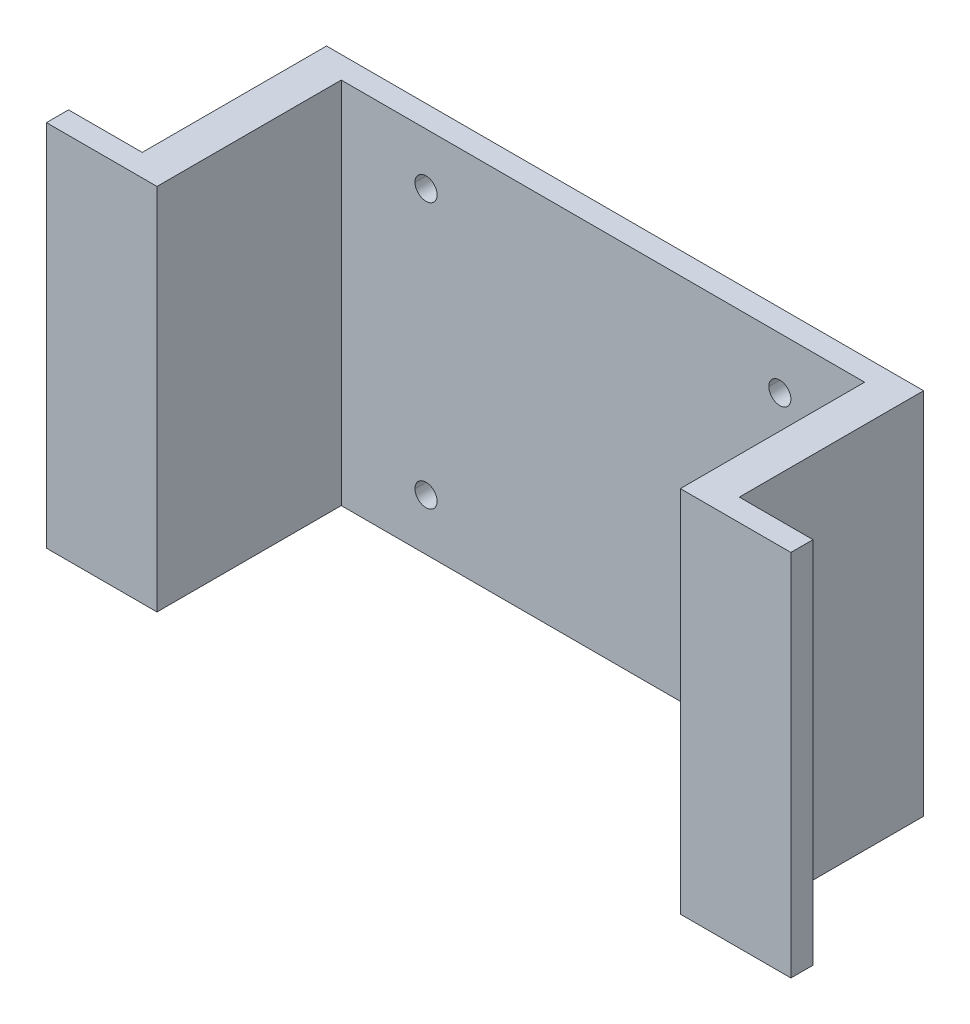
ISO-10303-21;
HEADER;
FILE_DESCRIPTION(('STEP AP214'),'2;1');
FILE_NAME('part.step','',(''),(''),'','','');
FILE_SCHEMA(('AUTOMOTIVE_DESIGN { 1 0 10303 214 1 1 1 1 }'));
ENDSEC;
DATA;
#1=APPLICATION_CONTEXT('core data for automotive mechanical design processes');
#2=APPLICATION_PROTOCOL_DEFINITION('international standard','automotive_design',2000,#1);
#3=PRODUCT_CONTEXT('',#1,'mechanical');
#4=PRODUCT('Part','Part','',(#3));
#5=PRODUCT_RELATED_PRODUCT_CATEGORY('part','',(#4));
#6=PRODUCT_DEFINITION_FORMATION('','',#4);
#7=PRODUCT_DEFINITION_CONTEXT('part definition',#1,'design');
#8=PRODUCT_DEFINITION('design','',#6,#7);
#9=PRODUCT_DEFINITION_SHAPE('','',#8);
#10=(LENGTH_UNIT() NAMED_UNIT(*) SI_UNIT(.MILLI.,.METRE.));
#11=(NAMED_UNIT(*) PLANE_ANGLE_UNIT() SI_UNIT($,.RADIAN.));
#12=(NAMED_UNIT(*) SI_UNIT($,.STERADIAN.) SOLID_ANGLE_UNIT());
#13=UNCERTAINTY_MEASURE_WITH_UNIT(LENGTH_MEASURE(1.E-05),#10,'distance_accuracy_value','');
#14=(GEOMETRIC_REPRESENTATION_CONTEXT(3) GLOBAL_UNCERTAINTY_ASSIGNED_CONTEXT((#13)) GLOBAL_UNIT_ASSIGNED_CONTEXT((#10,
#11,#12)) REPRESENTATION_CONTEXT('',''));
#15=CARTESIAN_POINT('',(0.,0.,0.));
#16=DIRECTION('',(0.,0.,1.));
#17=DIRECTION('',(1.,0.,0.));
#18=AXIS2_PLACEMENT_3D('',#15,#16,#17);
#19=CARTESIAN_POINT('',(50.5,0.,0.));
#20=DIRECTION('',(1.,0.,0.));
#21=DIRECTION('',(0.,1.,0.));
#22=AXIS2_PLACEMENT_3D('',#19,#20,#21);
#23=PLANE('',#22);
#24=DIRECTION('',(0.,0.,1.));
#25=VECTOR('',#24,1.);
#26=CARTESIAN_POINT('',(50.5,25.,25.));
#27=LINE('',#26,#25);
#28=CARTESIAN_POINT('',(50.5,25.,25.));
#29=VERTEX_POINT('',#28);
#30=CARTESIAN_POINT('',(50.5,25.,28.));
#31=VERTEX_POINT('',#30);
#32=EDGE_CURVE('E273',#29,#31,#27,.T.);
#33=ORIENTED_EDGE('',*,*,#32,.T.);
#34=DIRECTION('',(0.,-1.,0.));
#35=VECTOR('',#34,1.);
#36=CARTESIAN_POINT('',(50.5,25.,28.));
#37=LINE('',#36,#35);
#38=CARTESIAN_POINT('',(50.5,-25.,28.));
#39=VERTEX_POINT('',#38);
#40=EDGE_CURVE('E306',#31,#39,#37,.T.);
#41=ORIENTED_EDGE('',*,*,#40,.T.);
#42=DIRECTION('',(0.,0.,-1.));
#43=VECTOR('',#42,1.);
#44=CARTESIAN_POINT('',(50.5,-25.,28.));
#45=LINE('',#44,#43);
#46=CARTESIAN_POINT('',(50.5,-25.,25.));
#47=VERTEX_POINT('',#46);
#48=EDGE_CURVE('E249',#39,#47,#45,.T.);
#49=ORIENTED_EDGE('',*,*,#48,.T.);
#50=DIRECTION('',(0.,1.,0.));
#51=VECTOR('',#50,1.);
#52=CARTESIAN_POINT('',(50.5,-25.,25.));
#53=LINE('',#52,#51);
#54=EDGE_CURVE('E10',#47,#29,#53,.T.);
#55=ORIENTED_EDGE('',*,*,#54,.T.);
#56=EDGE_LOOP('',(#33,#41,#49,#55));
#57=FACE_BOUND('',#56,.T.);
#58=ADVANCED_FACE('F16',(#57),#23,.T.);
#59=CARTESIAN_POINT('',(50.5,-25.,25.));
#60=DIRECTION('',(0.,0.,1.));
#61=DIRECTION('',(1.,0.,0.));
#62=AXIS2_PLACEMENT_3D('',#59,#60,#61);
#63=PLANE('',#62);
#64=DIRECTION('',(0.,1.,0.));
#65=VECTOR('',#64,1.);
#66=CARTESIAN_POINT('',(40.5,-25.,25.));
#67=LINE('',#66,#65);
#68=CARTESIAN_POINT('',(40.5,-25.,25.));
#69=VERTEX_POINT('',#68);
#70=CARTESIAN_POINT('',(40.5,25.,25.));
#71=VERTEX_POINT('',#70);
#72=EDGE_CURVE('E289',#69,#71,#67,.T.);
#73=ORIENTED_EDGE('',*,*,#72,.T.);
#74=DIRECTION('',(-1.,0.,0.));
#75=VECTOR('',#74,1.);
#76=CARTESIAN_POINT('',(50.5,25.,25.));
#77=LINE('',#76,#75);
#78=EDGE_CURVE('E276',#29,#71,#77,.T.);
#79=ORIENTED_EDGE('',*,*,#78,.F.);
#80=ORIENTED_EDGE('',*,*,#54,.F.);
#81=DIRECTION('',(-1.,0.,0.));
#82=VECTOR('',#81,1.);
#83=CARTESIAN_POINT('',(50.5,-25.,25.));
#84=LINE('',#83,#82);
#85=EDGE_CURVE('E94',#47,#69,#84,.T.);
#86=ORIENTED_EDGE('',*,*,#85,.T.);
#87=EDGE_LOOP('',(#73,#79,#80,#86));
#88=FACE_BOUND('',#87,.T.);
#89=ADVANCED_FACE('F451',(#88),#63,.F.);
#90=CARTESIAN_POINT('',(-50.5,0.,0.));
#91=DIRECTION('',(-1.,0.,0.));
#92=DIRECTION('',(0.,0.,1.));
#93=AXIS2_PLACEMENT_3D('',#90,#91,#92);
#94=PLANE('',#93);
#95=DIRECTION('',(0.,0.,-1.));
#96=VECTOR('',#95,1.);
#97=CARTESIAN_POINT('',(-50.5,25.,28.));
#98=LINE('',#97,#96);
#99=CARTESIAN_POINT('',(-50.5,25.,28.));
#100=VERTEX_POINT('',#99);
#101=CARTESIAN_POINT('',(-50.5,25.,25.));
#102=VERTEX_POINT('',#101);
#103=EDGE_CURVE('E303',#100,#102,#98,.T.);
#104=ORIENTED_EDGE('',*,*,#103,.T.);
#105=DIRECTION('',(0.,-1.,0.));
#106=VECTOR('',#105,1.);
#107=CARTESIAN_POINT('',(-50.5,25.,25.));
#108=LINE('',#107,#106);
#109=CARTESIAN_POINT('',(-50.5,-25.,25.));
#110=VERTEX_POINT('',#109);
#111=EDGE_CURVE('E27',#102,#110,#108,.T.);
#112=ORIENTED_EDGE('',*,*,#111,.T.);
#113=DIRECTION('',(0.,0.,1.));
#114=VECTOR('',#113,1.);
#115=CARTESIAN_POINT('',(-50.5,-25.,25.));
#116=LINE('',#115,#114);
#117=CARTESIAN_POINT('',(-50.5,-25.,28.));
#118=VERTEX_POINT('',#117);
#119=EDGE_CURVE('E285',#110,#118,#116,.T.);
#120=ORIENTED_EDGE('',*,*,#119,.T.);
#121=DIRECTION('',(0.,1.,0.));
#122=VECTOR('',#121,1.);
#123=CARTESIAN_POINT('',(-50.5,-25.,28.));
#124=LINE('',#123,#122);
#125=EDGE_CURVE('E318',#118,#100,#124,.T.);
#126=ORIENTED_EDGE('',*,*,#125,.T.);
#127=EDGE_LOOP('',(#104,#112,#120,#126));
#128=FACE_BOUND('',#127,.T.);
#129=ADVANCED_FACE('F449',(#128),#94,.T.);
#130=CARTESIAN_POINT('',(-50.5,25.,25.));
#131=DIRECTION('',(0.,0.,1.));
#132=DIRECTION('',(0.,-1.,0.));
#133=AXIS2_PLACEMENT_3D('',#130,#131,#132);
#134=PLANE('',#133);
#135=DIRECTION('',(0.,-1.,0.));
#136=VECTOR('',#135,1.);
#137=CARTESIAN_POINT('',(-40.5,25.,25.));
#138=LINE('',#137,#136);
#139=CARTESIAN_POINT('',(-40.5,25.,25.));
#140=VERTEX_POINT('',#139);
#141=CARTESIAN_POINT('',(-40.5,-25.,25.));
#142=VERTEX_POINT('',#141);
#143=EDGE_CURVE('E267',#140,#142,#138,.T.);
#144=ORIENTED_EDGE('',*,*,#143,.T.);
#145=DIRECTION('',(1.,0.,0.));
#146=VECTOR('',#145,1.);
#147=CARTESIAN_POINT('',(-50.5,-25.,25.));
#148=LINE('',#147,#146);
#149=EDGE_CURVE('E209',#110,#142,#148,.T.);
#150=ORIENTED_EDGE('',*,*,#149,.F.);
#151=ORIENTED_EDGE('',*,*,#111,.F.);
#152=DIRECTION('',(1.,0.,0.));
#153=VECTOR('',#152,1.);
#154=CARTESIAN_POINT('',(-50.5,25.,25.));
#155=LINE('',#154,#153);
#156=EDGE_CURVE('E300',#102,#140,#155,.T.);
#157=ORIENTED_EDGE('',*,*,#156,.T.);
#158=EDGE_LOOP('',(#144,#150,#151,#157));
#159=FACE_BOUND('',#158,.T.);
#160=ADVANCED_FACE('F448',(#159),#134,.F.);
#161=CARTESIAN_POINT('',(0.,0.,28.));
#162=DIRECTION('',(0.,0.,-1.));
#163=DIRECTION('',(0.,-1.,0.));
#164=AXIS2_PLACEMENT_3D('',#161,#162,#163);
#165=PLANE('',#164);
#166=DIRECTION('',(-1.,0.,0.));
#167=VECTOR('',#166,1.);
#168=CARTESIAN_POINT('',(35.5,25.,28.));
#169=LINE('',#168,#167);
#170=CARTESIAN_POINT('',(35.5,25.,28.));
#171=VERTEX_POINT('',#170);
#172=EDGE_CURVE('E277',#31,#171,#169,.T.);
#173=ORIENTED_EDGE('',*,*,#172,.T.);
#174=DIRECTION('',(0.,-1.,0.));
#175=VECTOR('',#174,1.);
#176=CARTESIAN_POINT('',(35.5,-25.,28.));
#177=LINE('',#176,#175);
#178=CARTESIAN_POINT('',(35.5,-25.,28.));
#179=VERTEX_POINT('',#178);
#180=EDGE_CURVE('E360',#171,#179,#177,.T.);
#181=ORIENTED_EDGE('',*,*,#180,.T.);
#182=DIRECTION('',(1.,0.,0.));
#183=VECTOR('',#182,1.);
#184=CARTESIAN_POINT('',(40.5,-25.,28.));
#185=LINE('',#184,#183);
#186=EDGE_CURVE('E237',#179,#39,#185,.T.);
#187=ORIENTED_EDGE('',*,*,#186,.T.);
#188=ORIENTED_EDGE('',*,*,#40,.F.);
#189=EDGE_LOOP('',(#173,#181,#187,#188));
#190=FACE_BOUND('',#189,.T.);
#191=ADVANCED_FACE('F458',(#190),#165,.F.);
#192=CARTESIAN_POINT('',(35.5,-25.,28.));
#193=DIRECTION('',(1.,0.,0.));
#194=DIRECTION('',(0.,1.,0.));
#195=AXIS2_PLACEMENT_3D('',#192,#193,#194);
#196=PLANE('',#195);
#197=DIRECTION('',(0.,-1.,0.));
#198=VECTOR('',#197,1.);
#199=CARTESIAN_POINT('',(35.5,-25.,3.));
#200=LINE('',#199,#198);
#201=CARTESIAN_POINT('',(35.5,25.,3.));
#202=VERTEX_POINT('',#201);
#203=CARTESIAN_POINT('',(35.5,-25.,3.));
#204=VERTEX_POINT('',#203);
#205=EDGE_CURVE('E335',#202,#204,#200,.T.);
#206=ORIENTED_EDGE('',*,*,#205,.T.);
#207=DIRECTION('',(0.,0.,-1.));
#208=VECTOR('',#207,1.);
#209=CARTESIAN_POINT('',(35.5,-25.,28.));
#210=LINE('',#209,#208);
#211=EDGE_CURVE('E232',#179,#204,#210,.T.);
#212=ORIENTED_EDGE('',*,*,#211,.F.);
#213=ORIENTED_EDGE('',*,*,#180,.F.);
#214=DIRECTION('',(0.,0.,-1.));
#215=VECTOR('',#214,1.);
#216=CARTESIAN_POINT('',(35.5,25.,28.));
#217=LINE('',#216,#215);
#218=EDGE_CURVE('E328',#171,#202,#217,.T.);
#219=ORIENTED_EDGE('',*,*,#218,.T.);
#220=EDGE_LOOP('',(#206,#212,#213,#219));
#221=FACE_BOUND('',#220,.T.);
#222=ADVANCED_FACE('F472',(#221),#196,.F.);
#223=CARTESIAN_POINT('',(0.,0.,28.));
#224=DIRECTION('',(0.,0.,1.));
#225=DIRECTION('',(1.,0.,0.));
#226=AXIS2_PLACEMENT_3D('',#223,#224,#225);
#227=PLANE('',#226);
#228=DIRECTION('',(-1.,0.,0.));
#229=VECTOR('',#228,1.);
#230=CARTESIAN_POINT('',(-35.5,25.,28.));
#231=LINE('',#230,#229);
#232=CARTESIAN_POINT('',(-35.5,25.,28.));
#233=VERTEX_POINT('',#232);
#234=EDGE_CURVE('E327',#233,#100,#231,.T.);
#235=ORIENTED_EDGE('',*,*,#234,.T.);
#236=ORIENTED_EDGE('',*,*,#125,.F.);
#237=DIRECTION('',(1.,0.,0.));
#238=VECTOR('',#237,1.);
#239=CARTESIAN_POINT('',(-40.5,-25.,28.));
#240=LINE('',#239,#238);
#241=CARTESIAN_POINT('',(-35.5,-25.,28.));
#242=VERTEX_POINT('',#241);
#243=EDGE_CURVE('E288',#118,#242,#240,.T.);
#244=ORIENTED_EDGE('',*,*,#243,.T.);
#245=DIRECTION('',(0.,1.,0.));
#246=VECTOR('',#245,1.);
#247=CARTESIAN_POINT('',(-35.5,-25.,28.));
#248=LINE('',#247,#246);
#249=EDGE_CURVE('E315',#242,#233,#248,.T.);
#250=ORIENTED_EDGE('',*,*,#249,.T.);
#251=EDGE_LOOP('',(#235,#236,#244,#250));
#252=FACE_BOUND('',#251,.T.);
#253=ADVANCED_FACE('F403',(#252),#227,.T.);
#254=CARTESIAN_POINT('',(-35.5,-25.,28.));
#255=DIRECTION('',(-1.,0.,0.));
#256=DIRECTION('',(0.,0.,1.));
#257=AXIS2_PLACEMENT_3D('',#254,#255,#256);
#258=PLANE('',#257);
#259=DIRECTION('',(0.,1.,0.));
#260=VECTOR('',#259,1.);
#261=CARTESIAN_POINT('',(-35.5,-25.,3.));
#262=LINE('',#261,#260);
#263=CARTESIAN_POINT('',(-35.5,-25.,3.));
#264=VERTEX_POINT('',#263);
#265=CARTESIAN_POINT('',(-35.5,25.,3.));
#266=VERTEX_POINT('',#265);
#267=EDGE_CURVE('E341',#264,#266,#262,.T.);
#268=ORIENTED_EDGE('',*,*,#267,.T.);
#269=DIRECTION('',(0.,0.,-1.));
#270=VECTOR('',#269,1.);
#271=CARTESIAN_POINT('',(-35.5,25.,28.));
#272=LINE('',#271,#270);
#273=EDGE_CURVE('E331',#233,#266,#272,.T.);
#274=ORIENTED_EDGE('',*,*,#273,.F.);
#275=ORIENTED_EDGE('',*,*,#249,.F.);
#276=DIRECTION('',(0.,0.,-1.));
#277=VECTOR('',#276,1.);
#278=CARTESIAN_POINT('',(-35.5,-25.,28.));
#279=LINE('',#278,#277);
#280=EDGE_CURVE('E236',#242,#264,#279,.T.);
#281=ORIENTED_EDGE('',*,*,#280,.T.);
#282=EDGE_LOOP('',(#268,#274,#275,#281));
#283=FACE_BOUND('',#282,.T.);
#284=ADVANCED_FACE('F410',(#283),#258,.F.);
#285=CARTESIAN_POINT('',(-24.,18.,3.));
#286=DIRECTION('',(0.,0.,-1.));
#287=DIRECTION('',(-1.,0.,0.));
#288=AXIS2_PLACEMENT_3D('',#285,#286,#287);
#289=CYLINDRICAL_SURFACE('',#288,1.5);
#290=DIRECTION('',(0.,0.,-1.));
#291=VECTOR('',#290,1.);
#292=CARTESIAN_POINT('',(-22.5,18.,3.));
#293=LINE('',#292,#291);
#294=CARTESIAN_POINT('',(-22.5,18.,3.));
#295=VERTEX_POINT('',#294);
#296=CARTESIAN_POINT('',(-22.5,18.,0.));
#297=VERTEX_POINT('',#296);
#298=EDGE_CURVE('E220',#295,#297,#293,.T.);
#299=ORIENTED_EDGE('',*,*,#298,.F.);
#300=CARTESIAN_POINT('',(-24.,18.,3.));
#301=DIRECTION('',(0.,0.,-1.));
#302=DIRECTION('',(-1.,0.,0.));
#303=AXIS2_PLACEMENT_3D('',#300,#301,#302);
#304=CIRCLE('',#303,1.5);
#305=CARTESIAN_POINT('',(-25.5,18.,3.));
#306=VERTEX_POINT('',#305);
#307=EDGE_CURVE('E213',#306,#295,#304,.T.);
#308=ORIENTED_EDGE('',*,*,#307,.F.);
#309=DIRECTION('',(0.,0.,-1.));
#310=VECTOR('',#309,1.);
#311=CARTESIAN_POINT('',(-25.5,18.,3.));
#312=LINE('',#311,#310);
#313=CARTESIAN_POINT('',(-25.5,18.,0.));
#314=VERTEX_POINT('',#313);
#315=EDGE_CURVE('E20',#306,#314,#312,.T.);
#316=ORIENTED_EDGE('',*,*,#315,.T.);
#317=CARTESIAN_POINT('',(-24.,18.,0.));
#318=DIRECTION('',(0.,0.,-1.));
#319=DIRECTION('',(-1.,0.,0.));
#320=AXIS2_PLACEMENT_3D('',#317,#318,#319);
#321=CIRCLE('',#320,1.5);
#322=EDGE_CURVE('E199',#314,#297,#321,.T.);
#323=ORIENTED_EDGE('',*,*,#322,.T.);
#324=EDGE_LOOP('',(#299,#308,#316,#323));
#325=FACE_BOUND('',#324,.T.);
#326=ADVANCED_FACE('F212',(#325),#289,.F.);
#327=CARTESIAN_POINT('',(24.,-18.,3.));
#328=DIRECTION('',(0.,0.,-1.));
#329=DIRECTION('',(-1.,0.,0.));
#330=AXIS2_PLACEMENT_3D('',#327,#328,#329);
#331=CYLINDRICAL_SURFACE('',#330,1.5);
#332=DIRECTION('',(0.,0.,-1.));
#333=VECTOR('',#332,1.);
#334=CARTESIAN_POINT('',(25.5,-18.,3.));
#335=LINE('',#334,#333);
#336=CARTESIAN_POINT('',(25.5,-18.,3.));
#337=VERTEX_POINT('',#336);
#338=CARTESIAN_POINT('',(25.5,-18.,0.));
#339=VERTEX_POINT('',#338);
#340=EDGE_CURVE('E242',#337,#339,#335,.T.);
#341=ORIENTED_EDGE('',*,*,#340,.F.);
#342=CARTESIAN_POINT('',(24.,-18.,3.));
#343=DIRECTION('',(0.,0.,-1.));
#344=DIRECTION('',(-1.,0.,0.));
#345=AXIS2_PLACEMENT_3D('',#342,#343,#344);
#346=CIRCLE('',#345,1.5);
#347=CARTESIAN_POINT('',(22.5,-18.,3.));
#348=VERTEX_POINT('',#347);
#349=EDGE_CURVE('E248',#348,#337,#346,.T.);
#350=ORIENTED_EDGE('',*,*,#349,.F.);
#351=DIRECTION('',(0.,0.,-1.));
#352=VECTOR('',#351,1.);
#353=CARTESIAN_POINT('',(22.5,-18.,3.));
#354=LINE('',#353,#352);
#355=CARTESIAN_POINT('',(22.5,-18.,0.));
#356=VERTEX_POINT('',#355);
#357=EDGE_CURVE('E230',#348,#356,#354,.T.);
#358=ORIENTED_EDGE('',*,*,#357,.T.);
#359=CARTESIAN_POINT('',(24.,-18.,0.));
#360=DIRECTION('',(0.,0.,-1.));
#361=DIRECTION('',(-1.,0.,0.));
#362=AXIS2_PLACEMENT_3D('',#359,#360,#361);
#363=CIRCLE('',#362,1.5);
#364=EDGE_CURVE('E208',#356,#339,#363,.T.);
#365=ORIENTED_EDGE('',*,*,#364,.T.);
#366=EDGE_LOOP('',(#341,#350,#358,#365));
#367=FACE_BOUND('',#366,.T.);
#368=ADVANCED_FACE('F468',(#367),#331,.F.);
#369=CARTESIAN_POINT('',(-24.,-18.,3.));
#370=DIRECTION('',(0.,0.,-1.));
#371=DIRECTION('',(-1.,0.,0.));
#372=AXIS2_PLACEMENT_3D('',#369,#370,#371);
#373=CYLINDRICAL_SURFACE('',#372,1.5);
#374=DIRECTION('',(0.,0.,-1.));
#375=VECTOR('',#374,1.);
#376=CARTESIAN_POINT('',(-22.5,-18.,3.));
#377=LINE('',#376,#375);
#378=CARTESIAN_POINT('',(-22.5,-18.,3.));
#379=VERTEX_POINT('',#378);
#380=CARTESIAN_POINT('',(-22.5,-18.,0.));
#381=VERTEX_POINT('',#380);
#382=EDGE_CURVE('E259',#379,#381,#377,.T.);
#383=ORIENTED_EDGE('',*,*,#382,.F.);
#384=CARTESIAN_POINT('',(-24.,-18.,3.));
#385=DIRECTION('',(0.,0.,-1.));
#386=DIRECTION('',(-1.,0.,0.));
#387=AXIS2_PLACEMENT_3D('',#384,#385,#386);
#388=CIRCLE('',#387,1.5);
#389=CARTESIAN_POINT('',(-25.5,-18.,3.));
#390=VERTEX_POINT('',#389);
#391=EDGE_CURVE('E243',#390,#379,#388,.T.);
#392=ORIENTED_EDGE('',*,*,#391,.F.);
#393=DIRECTION('',(0.,0.,-1.));
#394=VECTOR('',#393,1.);
#395=CARTESIAN_POINT('',(-25.5,-18.,3.));
#396=LINE('',#395,#394);
#397=CARTESIAN_POINT('',(-25.5,-18.,0.));
#398=VERTEX_POINT('',#397);
#399=EDGE_CURVE('E310',#390,#398,#396,.T.);
#400=ORIENTED_EDGE('',*,*,#399,.T.);
#401=CARTESIAN_POINT('',(-24.,-18.,0.));
#402=DIRECTION('',(0.,0.,-1.));
#403=DIRECTION('',(-1.,0.,0.));
#404=AXIS2_PLACEMENT_3D('',#401,#402,#403);
#405=CIRCLE('',#404,1.5);
#406=EDGE_CURVE('E263',#398,#381,#405,.T.);
#407=ORIENTED_EDGE('',*,*,#406,.T.);
#408=EDGE_LOOP('',(#383,#392,#400,#407));
#409=FACE_BOUND('',#408,.T.);
#410=ADVANCED_FACE('F18',(#409),#373,.F.);
#411=CARTESIAN_POINT('',(24.,18.,3.));
#412=DIRECTION('',(0.,0.,-1.));
#413=DIRECTION('',(-1.,0.,0.));
#414=AXIS2_PLACEMENT_3D('',#411,#412,#413);
#415=CYLINDRICAL_SURFACE('',#414,1.5);
#416=DIRECTION('',(0.,0.,-1.));
#417=VECTOR('',#416,1.);
#418=CARTESIAN_POINT('',(25.5,18.,3.));
#419=LINE('',#418,#417);
#420=CARTESIAN_POINT('',(25.5,18.,3.));
#421=VERTEX_POINT('',#420);
#422=CARTESIAN_POINT('',(25.5,18.,0.));
#423=VERTEX_POINT('',#422);
#424=EDGE_CURVE('E294',#421,#423,#419,.T.);
#425=ORIENTED_EDGE('',*,*,#424,.F.);
#426=CARTESIAN_POINT('',(24.,18.,3.));
#427=DIRECTION('',(0.,0.,-1.));
#428=DIRECTION('',(-1.,0.,0.));
#429=AXIS2_PLACEMENT_3D('',#426,#427,#428);
#430=CIRCLE('',#429,1.5);
#431=CARTESIAN_POINT('',(22.5,18.,3.));
#432=VERTEX_POINT('',#431);
#433=EDGE_CURVE('E247',#432,#421,#430,.T.);
#434=ORIENTED_EDGE('',*,*,#433,.F.);
#435=DIRECTION('',(0.,0.,-1.));
#436=VECTOR('',#435,1.);
#437=CARTESIAN_POINT('',(22.5,18.,3.));
#438=LINE('',#437,#436);
#439=CARTESIAN_POINT('',(22.5,18.,0.));
#440=VERTEX_POINT('',#439);
#441=EDGE_CURVE('E293',#432,#440,#438,.T.);
#442=ORIENTED_EDGE('',*,*,#441,.T.);
#443=CARTESIAN_POINT('',(24.,18.,0.));
#444=DIRECTION('',(0.,0.,-1.));
#445=DIRECTION('',(-1.,0.,0.));
#446=AXIS2_PLACEMENT_3D('',#443,#444,#445);
#447=CIRCLE('',#446,1.5);
#448=EDGE_CURVE('E80',#440,#423,#447,.T.);
#449=ORIENTED_EDGE('',*,*,#448,.T.);
#450=EDGE_LOOP('',(#425,#434,#442,#449));
#451=FACE_BOUND('',#450,.T.);
#452=ADVANCED_FACE('F484',(#451),#415,.F.);
#453=CARTESIAN_POINT('',(0.,0.,0.));
#454=DIRECTION('',(0.,0.,1.));
#455=DIRECTION('',(1.,0.,0.));
#456=AXIS2_PLACEMENT_3D('',#453,#454,#455);
#457=PLANE('',#456);
#458=ORIENTED_EDGE('',*,*,#448,.F.);
#459=CARTESIAN_POINT('',(24.,18.,0.));
#460=DIRECTION('',(0.,0.,-1.));
#461=DIRECTION('',(-1.,0.,0.));
#462=AXIS2_PLACEMENT_3D('',#459,#460,#461);
#463=CIRCLE('',#462,1.5);
#464=EDGE_CURVE('E297',#423,#440,#463,.T.);
#465=ORIENTED_EDGE('',*,*,#464,.F.);
#466=EDGE_LOOP('',(#458,#465));
#467=FACE_BOUND('',#466,.T.);
#468=ORIENTED_EDGE('',*,*,#406,.F.);
#469=CARTESIAN_POINT('',(-24.,-18.,0.));
#470=DIRECTION('',(0.,0.,-1.));
#471=DIRECTION('',(-1.,0.,0.));
#472=AXIS2_PLACEMENT_3D('',#469,#470,#471);
#473=CIRCLE('',#472,1.5);
#474=EDGE_CURVE('E314',#381,#398,#473,.T.);
#475=ORIENTED_EDGE('',*,*,#474,.F.);
#476=EDGE_LOOP('',(#468,#475));
#477=FACE_BOUND('',#476,.T.);
#478=ORIENTED_EDGE('',*,*,#364,.F.);
#479=CARTESIAN_POINT('',(24.,-18.,0.));
#480=DIRECTION('',(0.,0.,-1.));
#481=DIRECTION('',(-1.,0.,0.));
#482=AXIS2_PLACEMENT_3D('',#479,#480,#481);
#483=CIRCLE('',#482,1.5);
#484=EDGE_CURVE('E238',#339,#356,#483,.T.);
#485=ORIENTED_EDGE('',*,*,#484,.F.);
#486=EDGE_LOOP('',(#478,#485));
#487=FACE_BOUND('',#486,.T.);
#488=ORIENTED_EDGE('',*,*,#322,.F.);
#489=CARTESIAN_POINT('',(-24.,18.,0.));
#490=DIRECTION('',(0.,0.,-1.));
#491=DIRECTION('',(-1.,0.,0.));
#492=AXIS2_PLACEMENT_3D('',#489,#490,#491);
#493=CIRCLE('',#492,1.5);
#494=EDGE_CURVE('E203',#297,#314,#493,.T.);
#495=ORIENTED_EDGE('',*,*,#494,.F.);
#496=EDGE_LOOP('',(#488,#495));
#497=FACE_BOUND('',#496,.T.);
#498=DIRECTION('',(0.,1.,0.));
#499=VECTOR('',#498,1.);
#500=CARTESIAN_POINT('',(40.5,25.,0.));
#501=LINE('',#500,#499);
#502=CARTESIAN_POINT('',(40.5,-25.,0.));
#503=VERTEX_POINT('',#502);
#504=CARTESIAN_POINT('',(40.5,25.,0.));
#505=VERTEX_POINT('',#504);
#506=EDGE_CURVE('E321',#503,#505,#501,.T.);
#507=ORIENTED_EDGE('',*,*,#506,.F.);
#508=DIRECTION('',(1.,0.,0.));
#509=VECTOR('',#508,1.);
#510=CARTESIAN_POINT('',(-40.5,-25.,0.));
#511=LINE('',#510,#509);
#512=CARTESIAN_POINT('',(-40.5,-25.,0.));
#513=VERTEX_POINT('',#512);
#514=EDGE_CURVE('E140',#513,#503,#511,.T.);
#515=ORIENTED_EDGE('',*,*,#514,.F.);
#516=DIRECTION('',(0.,-1.,0.));
#517=VECTOR('',#516,1.);
#518=CARTESIAN_POINT('',(-40.5,25.,0.));
#519=LINE('',#518,#517);
#520=CARTESIAN_POINT('',(-40.5,25.,0.));
#521=VERTEX_POINT('',#520);
#522=EDGE_CURVE('E351',#521,#513,#519,.T.);
#523=ORIENTED_EDGE('',*,*,#522,.F.);
#524=DIRECTION('',(-1.,0.,0.));
#525=VECTOR('',#524,1.);
#526=CARTESIAN_POINT('',(-40.5,25.,0.));
#527=LINE('',#526,#525);
#528=EDGE_CURVE('E153',#505,#521,#527,.T.);
#529=ORIENTED_EDGE('',*,*,#528,.F.);
#530=EDGE_LOOP('',(#507,#515,#523,#529));
#531=FACE_BOUND('',#530,.T.);
#532=ADVANCED_FACE('F201',(#467,#477,#487,#497,#531),#457,.F.);
#533=CARTESIAN_POINT('',(-40.5,-25.,3.));
#534=DIRECTION('',(0.,1.,0.));
#535=DIRECTION('',(1.,0.,0.));
#536=AXIS2_PLACEMENT_3D('',#533,#534,#535);
#537=PLANE('',#536);
#538=ORIENTED_EDGE('',*,*,#514,.T.);
#539=DIRECTION('',(0.,0.,-1.));
#540=VECTOR('',#539,1.);
#541=CARTESIAN_POINT('',(40.5,-25.,3.));
#542=LINE('',#541,#540);
#543=EDGE_CURVE('E292',#69,#503,#542,.T.);
#544=ORIENTED_EDGE('',*,*,#543,.F.);
#545=ORIENTED_EDGE('',*,*,#85,.F.);
#546=ORIENTED_EDGE('',*,*,#48,.F.);
#547=ORIENTED_EDGE('',*,*,#186,.F.);
#548=ORIENTED_EDGE('',*,*,#211,.T.);
#549=DIRECTION('',(1.,0.,0.));
#550=VECTOR('',#549,1.);
#551=CARTESIAN_POINT('',(-40.5,-25.,3.));
#552=LINE('',#551,#550);
#553=EDGE_CURVE('E340',#264,#204,#552,.T.);
#554=ORIENTED_EDGE('',*,*,#553,.F.);
#555=ORIENTED_EDGE('',*,*,#280,.F.);
#556=ORIENTED_EDGE('',*,*,#243,.F.);
#557=ORIENTED_EDGE('',*,*,#119,.F.);
#558=ORIENTED_EDGE('',*,*,#149,.T.);
#559=DIRECTION('',(0.,0.,-1.));
#560=VECTOR('',#559,1.);
#561=CARTESIAN_POINT('',(-40.5,-25.,3.));
#562=LINE('',#561,#560);
#563=EDGE_CURVE('E364',#142,#513,#562,.T.);
#564=ORIENTED_EDGE('',*,*,#563,.T.);
#565=EDGE_LOOP('',(#538,#544,#545,#546,#547,#548,#554,#555,#556,#557,#558,#564));
#566=FACE_BOUND('',#565,.T.);
#567=ADVANCED_FACE('F407',(#566),#537,.F.);
#568=CARTESIAN_POINT('',(-40.5,25.,3.));
#569=DIRECTION('',(0.,-1.,0.));
#570=DIRECTION('',(0.,0.,-1.));
#571=AXIS2_PLACEMENT_3D('',#568,#569,#570);
#572=PLANE('',#571);
#573=ORIENTED_EDGE('',*,*,#528,.T.);
#574=DIRECTION('',(0.,0.,-1.));
#575=VECTOR('',#574,1.);
#576=CARTESIAN_POINT('',(-40.5,25.,3.));
#577=LINE('',#576,#575);
#578=EDGE_CURVE('E271',#140,#521,#577,.T.);
#579=ORIENTED_EDGE('',*,*,#578,.F.);
#580=ORIENTED_EDGE('',*,*,#156,.F.);
#581=ORIENTED_EDGE('',*,*,#103,.F.);
#582=ORIENTED_EDGE('',*,*,#234,.F.);
#583=ORIENTED_EDGE('',*,*,#273,.T.);
#584=DIRECTION('',(-1.,0.,0.));
#585=VECTOR('',#584,1.);
#586=CARTESIAN_POINT('',(-40.5,25.,3.));
#587=LINE('',#586,#585);
#588=EDGE_CURVE('E339',#202,#266,#587,.T.);
#589=ORIENTED_EDGE('',*,*,#588,.F.);
#590=ORIENTED_EDGE('',*,*,#218,.F.);
#591=ORIENTED_EDGE('',*,*,#172,.F.);
#592=ORIENTED_EDGE('',*,*,#32,.F.);
#593=ORIENTED_EDGE('',*,*,#78,.T.);
#594=DIRECTION('',(0.,0.,-1.));
#595=VECTOR('',#594,1.);
#596=CARTESIAN_POINT('',(40.5,25.,3.));
#597=LINE('',#596,#595);
#598=EDGE_CURVE('E272',#71,#505,#597,.T.);
#599=ORIENTED_EDGE('',*,*,#598,.T.);
#600=EDGE_LOOP('',(#573,#579,#580,#581,#582,#583,#589,#590,#591,#592,#593,#599));
#601=FACE_BOUND('',#600,.T.);
#602=ADVANCED_FACE('F420',(#601),#572,.F.);
#603=CARTESIAN_POINT('',(0.,0.,3.));
#604=DIRECTION('',(0.,0.,1.));
#605=DIRECTION('',(1.,0.,0.));
#606=AXIS2_PLACEMENT_3D('',#603,#604,#605);
#607=PLANE('',#606);
#608=ORIENTED_EDGE('',*,*,#433,.T.);
#609=CARTESIAN_POINT('',(24.,18.,3.));
#610=DIRECTION('',(0.,0.,-1.));
#611=DIRECTION('',(-1.,0.,0.));
#612=AXIS2_PLACEMENT_3D('',#609,#610,#611);
#613=CIRCLE('',#612,1.5);
#614=EDGE_CURVE('E298',#421,#432,#613,.T.);
#615=ORIENTED_EDGE('',*,*,#614,.T.);
#616=EDGE_LOOP('',(#608,#615));
#617=FACE_BOUND('',#616,.T.);
#618=ORIENTED_EDGE('',*,*,#391,.T.);
#619=CARTESIAN_POINT('',(-24.,-18.,3.));
#620=DIRECTION('',(0.,0.,-1.));
#621=DIRECTION('',(-1.,0.,0.));
#622=AXIS2_PLACEMENT_3D('',#619,#620,#621);
#623=CIRCLE('',#622,1.5);
#624=EDGE_CURVE('E255',#379,#390,#623,.T.);
#625=ORIENTED_EDGE('',*,*,#624,.T.);
#626=EDGE_LOOP('',(#618,#625));
#627=FACE_BOUND('',#626,.T.);
#628=ORIENTED_EDGE('',*,*,#349,.T.);
#629=CARTESIAN_POINT('',(24.,-18.,3.));
#630=DIRECTION('',(0.,0.,-1.));
#631=DIRECTION('',(-1.,0.,0.));
#632=AXIS2_PLACEMENT_3D('',#629,#630,#631);
#633=CIRCLE('',#632,1.5);
#634=EDGE_CURVE('E218',#337,#348,#633,.T.);
#635=ORIENTED_EDGE('',*,*,#634,.T.);
#636=EDGE_LOOP('',(#628,#635));
#637=FACE_BOUND('',#636,.T.);
#638=ORIENTED_EDGE('',*,*,#307,.T.);
#639=CARTESIAN_POINT('',(-24.,18.,3.));
#640=DIRECTION('',(0.,0.,-1.));
#641=DIRECTION('',(-1.,0.,0.));
#642=AXIS2_PLACEMENT_3D('',#639,#640,#641);
#643=CIRCLE('',#642,1.5);
#644=EDGE_CURVE('E226',#295,#306,#643,.T.);
#645=ORIENTED_EDGE('',*,*,#644,.T.);
#646=EDGE_LOOP('',(#638,#645));
#647=FACE_BOUND('',#646,.T.);
#648=ORIENTED_EDGE('',*,*,#553,.T.);
#649=ORIENTED_EDGE('',*,*,#205,.F.);
#650=ORIENTED_EDGE('',*,*,#588,.T.);
#651=ORIENTED_EDGE('',*,*,#267,.F.);
#652=EDGE_LOOP('',(#648,#649,#650,#651));
#653=FACE_BOUND('',#652,.T.);
#654=ADVANCED_FACE('F413',(#617,#627,#637,#647,#653),#607,.T.);
#655=CARTESIAN_POINT('',(-40.5,25.,3.));
#656=DIRECTION('',(1.,0.,0.));
#657=DIRECTION('',(0.,1.,0.));
#658=AXIS2_PLACEMENT_3D('',#655,#656,#657);
#659=PLANE('',#658);
#660=ORIENTED_EDGE('',*,*,#143,.F.);
#661=ORIENTED_EDGE('',*,*,#578,.T.);
#662=ORIENTED_EDGE('',*,*,#522,.T.);
#663=ORIENTED_EDGE('',*,*,#563,.F.);
#664=EDGE_LOOP('',(#660,#661,#662,#663));
#665=FACE_BOUND('',#664,.T.);
#666=ADVANCED_FACE('F445',(#665),#659,.F.);
#667=CARTESIAN_POINT('',(40.5,25.,3.));
#668=DIRECTION('',(-1.,0.,0.));
#669=DIRECTION('',(0.,0.,1.));
#670=AXIS2_PLACEMENT_3D('',#667,#668,#669);
#671=PLANE('',#670);
#672=ORIENTED_EDGE('',*,*,#72,.F.);
#673=ORIENTED_EDGE('',*,*,#543,.T.);
#674=ORIENTED_EDGE('',*,*,#506,.T.);
#675=ORIENTED_EDGE('',*,*,#598,.F.);
#676=EDGE_LOOP('',(#672,#673,#674,#675));
#677=FACE_BOUND('',#676,.T.);
#678=ADVANCED_FACE('F439',(#677),#671,.F.);
#679=CARTESIAN_POINT('',(24.,18.,3.));
#680=DIRECTION('',(0.,0.,-1.));
#681=DIRECTION('',(-1.,0.,0.));
#682=AXIS2_PLACEMENT_3D('',#679,#680,#681);
#683=CYLINDRICAL_SURFACE('',#682,1.5);
#684=ORIENTED_EDGE('',*,*,#614,.F.);
#685=ORIENTED_EDGE('',*,*,#424,.T.);
#686=ORIENTED_EDGE('',*,*,#464,.T.);
#687=ORIENTED_EDGE('',*,*,#441,.F.);
#688=EDGE_LOOP('',(#684,#685,#686,#687));
#689=FACE_BOUND('',#688,.T.);
#690=ADVANCED_FACE('F490',(#689),#683,.F.);
#691=CARTESIAN_POINT('',(-24.,-18.,3.));
#692=DIRECTION('',(0.,0.,-1.));
#693=DIRECTION('',(-1.,0.,0.));
#694=AXIS2_PLACEMENT_3D('',#691,#692,#693);
#695=CYLINDRICAL_SURFACE('',#694,1.5);
#696=ORIENTED_EDGE('',*,*,#624,.F.);
#697=ORIENTED_EDGE('',*,*,#382,.T.);
#698=ORIENTED_EDGE('',*,*,#474,.T.);
#699=ORIENTED_EDGE('',*,*,#399,.F.);
#700=EDGE_LOOP('',(#696,#697,#698,#699));
#701=FACE_BOUND('',#700,.T.);
#702=ADVANCED_FACE('F478',(#701),#695,.F.);
#703=CARTESIAN_POINT('',(24.,-18.,3.));
#704=DIRECTION('',(0.,0.,-1.));
#705=DIRECTION('',(-1.,0.,0.));
#706=AXIS2_PLACEMENT_3D('',#703,#704,#705);
#707=CYLINDRICAL_SURFACE('',#706,1.5);
#708=ORIENTED_EDGE('',*,*,#634,.F.);
#709=ORIENTED_EDGE('',*,*,#340,.T.);
#710=ORIENTED_EDGE('',*,*,#484,.T.);
#711=ORIENTED_EDGE('',*,*,#357,.F.);
#712=EDGE_LOOP('',(#708,#709,#710,#711));
#713=FACE_BOUND('',#712,.T.);
#714=ADVANCED_FACE('F475',(#713),#707,.F.);
#715=CARTESIAN_POINT('',(-24.,18.,3.));
#716=DIRECTION('',(0.,0.,-1.));
#717=DIRECTION('',(-1.,0.,0.));
#718=AXIS2_PLACEMENT_3D('',#715,#716,#717);
#719=CYLINDRICAL_SURFACE('',#718,1.5);
#720=ORIENTED_EDGE('',*,*,#644,.F.);
#721=ORIENTED_EDGE('',*,*,#298,.T.);
#722=ORIENTED_EDGE('',*,*,#494,.T.);
#723=ORIENTED_EDGE('',*,*,#315,.F.);
#724=EDGE_LOOP('',(#720,#721,#722,#723));
#725=FACE_BOUND('',#724,.T.);
#726=ADVANCED_FACE('F219',(#725),#719,.F.);
#727=CLOSED_SHELL('',(#58,#89,#129,#160,#191,#222,#253,#284,#326,#368,#410,#452,#532,#567,#602,
#654,#666,#678,#690,#702,#714,#726));
#728=MANIFOLD_SOLID_BREP('B1',#727);
#729=ADVANCED_BREP_SHAPE_REPRESENTATION('',(#18,#728),#14);
#730=SHAPE_DEFINITION_REPRESENTATION(#9,#729);
ENDSEC;
END-ISO-10303-21;
